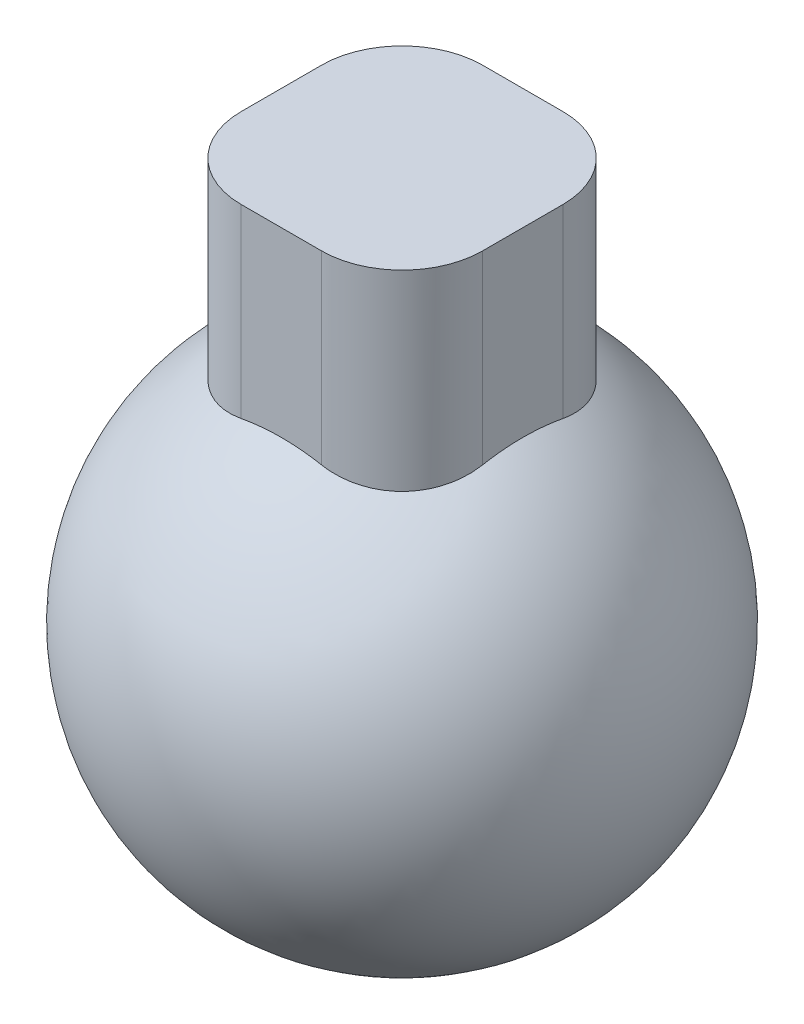
ISO-10303-21;
HEADER;
FILE_DESCRIPTION(('STEP AP214'),'2;1');
FILE_NAME('part.step','',(''),(''),'','','');
FILE_SCHEMA(('AUTOMOTIVE_DESIGN { 1 0 10303 214 1 1 1 1 }'));
ENDSEC;
DATA;
#1=APPLICATION_CONTEXT('core data for automotive mechanical design processes');
#2=APPLICATION_PROTOCOL_DEFINITION('international standard','automotive_design',2000,#1);
#3=PRODUCT_CONTEXT('',#1,'mechanical');
#4=PRODUCT('Part','Part','',(#3));
#5=PRODUCT_RELATED_PRODUCT_CATEGORY('part','',(#4));
#6=PRODUCT_DEFINITION_FORMATION('','',#4);
#7=PRODUCT_DEFINITION_CONTEXT('part definition',#1,'design');
#8=PRODUCT_DEFINITION('design','',#6,#7);
#9=PRODUCT_DEFINITION_SHAPE('','',#8);
#10=(LENGTH_UNIT() NAMED_UNIT(*) SI_UNIT(.MILLI.,.METRE.));
#11=(NAMED_UNIT(*) PLANE_ANGLE_UNIT() SI_UNIT($,.RADIAN.));
#12=(NAMED_UNIT(*) SI_UNIT($,.STERADIAN.) SOLID_ANGLE_UNIT());
#13=UNCERTAINTY_MEASURE_WITH_UNIT(LENGTH_MEASURE(1.E-05),#10,'distance_accuracy_value','');
#14=(GEOMETRIC_REPRESENTATION_CONTEXT(3) GLOBAL_UNCERTAINTY_ASSIGNED_CONTEXT((#13)) GLOBAL_UNIT_ASSIGNED_CONTEXT((#10,
#11,#12)) REPRESENTATION_CONTEXT('',''));
#15=CARTESIAN_POINT('',(0.,0.,0.));
#16=DIRECTION('',(0.,0.,1.));
#17=DIRECTION('',(1.,0.,0.));
#18=AXIS2_PLACEMENT_3D('',#15,#16,#17);
#19=CARTESIAN_POINT('',(-7.62,25.4,7.62));
#20=DIRECTION('',(1.,0.,0.));
#21=DIRECTION('',(0.,0.,-1.));
#22=AXIS2_PLACEMENT_3D('',#19,#20,#21);
#23=PLANE('',#22);
#24=DIRECTION('',(0.,0.,1.));
#25=VECTOR('',#24,1.);
#26=CARTESIAN_POINT('',(-7.62,25.4,7.62));
#27=LINE('',#26,#25);
#28=CARTESIAN_POINT('',(-7.62,25.4,-2.53999999999999));
#29=VERTEX_POINT('',#28);
#30=CARTESIAN_POINT('',(-7.62,25.4,2.54));
#31=VERTEX_POINT('',#30);
#32=EDGE_CURVE('E217',#29,#31,#27,.T.);
#33=ORIENTED_EDGE('',*,*,#32,.F.);
#34=DIRECTION('',(0.,-1.,0.));
#35=VECTOR('',#34,1.);
#36=CARTESIAN_POINT('',(-7.62,25.4,-2.54));
#37=LINE('',#36,#35);
#38=CARTESIAN_POINT('',(-7.62,13.6930502445584,-2.54));
#39=VERTEX_POINT('',#38);
#40=EDGE_CURVE('E111',#29,#39,#37,.T.);
#41=ORIENTED_EDGE('',*,*,#40,.T.);
#42=CARTESIAN_POINT('',(-7.62,0.,0.));
#43=DIRECTION('',(1.,0.,0.));
#44=DIRECTION('',(0.,0.,-1.));
#45=AXIS2_PLACEMENT_3D('',#42,#43,#44);
#46=CIRCLE('',#45,13.9266372466579);
#47=CARTESIAN_POINT('',(-7.62,13.6930502445584,2.54));
#48=VERTEX_POINT('',#47);
#49=EDGE_CURVE('E102',#48,#39,#46,.F.);
#50=ORIENTED_EDGE('',*,*,#49,.F.);
#51=DIRECTION('',(0.,-1.,0.));
#52=VECTOR('',#51,1.);
#53=CARTESIAN_POINT('',(-7.62,25.4,2.54));
#54=LINE('',#53,#52);
#55=EDGE_CURVE('E108',#48,#31,#54,.F.);
#56=ORIENTED_EDGE('',*,*,#55,.T.);
#57=EDGE_LOOP('',(#33,#41,#50,#56));
#58=FACE_BOUND('',#57,.T.);
#59=ADVANCED_FACE('F33',(#58),#23,.F.);
#60=CARTESIAN_POINT('',(7.62,25.4,7.62));
#61=DIRECTION('',(0.,0.,-1.));
#62=DIRECTION('',(-1.,0.,0.));
#63=AXIS2_PLACEMENT_3D('',#60,#61,#62);
#64=PLANE('',#63);
#65=DIRECTION('',(1.,0.,0.));
#66=VECTOR('',#65,1.);
#67=CARTESIAN_POINT('',(7.62,25.4,7.62));
#68=LINE('',#67,#66);
#69=CARTESIAN_POINT('',(-2.53999999999999,25.4,7.62));
#70=VERTEX_POINT('',#69);
#71=CARTESIAN_POINT('',(2.54,25.4,7.62));
#72=VERTEX_POINT('',#71);
#73=EDGE_CURVE('E214',#70,#72,#68,.T.);
#74=ORIENTED_EDGE('',*,*,#73,.F.);
#75=DIRECTION('',(0.,-1.,0.));
#76=VECTOR('',#75,1.);
#77=CARTESIAN_POINT('',(-2.54,25.4,7.62));
#78=LINE('',#77,#76);
#79=CARTESIAN_POINT('',(-2.54,13.6930502445584,7.62));
#80=VERTEX_POINT('',#79);
#81=EDGE_CURVE('E139',#70,#80,#78,.T.);
#82=ORIENTED_EDGE('',*,*,#81,.T.);
#83=CARTESIAN_POINT('',(0.,0.,7.62));
#84=DIRECTION('',(0.,0.,-1.));
#85=DIRECTION('',(-1.,0.,0.));
#86=AXIS2_PLACEMENT_3D('',#83,#84,#85);
#87=CIRCLE('',#86,13.9266372466579);
#88=CARTESIAN_POINT('',(2.54,13.6930502445584,7.62));
#89=VERTEX_POINT('',#88);
#90=EDGE_CURVE('E103',#89,#80,#87,.F.);
#91=ORIENTED_EDGE('',*,*,#90,.F.);
#92=DIRECTION('',(0.,-1.,0.));
#93=VECTOR('',#92,1.);
#94=CARTESIAN_POINT('',(2.54,25.4,7.62));
#95=LINE('',#94,#93);
#96=EDGE_CURVE('E137',#89,#72,#95,.F.);
#97=ORIENTED_EDGE('',*,*,#96,.T.);
#98=EDGE_LOOP('',(#74,#82,#91,#97));
#99=FACE_BOUND('',#98,.T.);
#100=ADVANCED_FACE('F176',(#99),#64,.F.);
#101=CARTESIAN_POINT('',(7.62,25.4,7.62));
#102=DIRECTION('',(-1.,0.,0.));
#103=DIRECTION('',(0.,0.,1.));
#104=AXIS2_PLACEMENT_3D('',#101,#102,#103);
#105=PLANE('',#104);
#106=CARTESIAN_POINT('',(7.62,0.,0.));
#107=DIRECTION('',(-1.,0.,0.));
#108=DIRECTION('',(0.,0.,1.));
#109=AXIS2_PLACEMENT_3D('',#106,#107,#108);
#110=CIRCLE('',#109,13.9266372466579);
#111=CARTESIAN_POINT('',(7.62,13.6930502445584,-2.54));
#112=VERTEX_POINT('',#111);
#113=CARTESIAN_POINT('',(7.62,13.6930502445584,2.54));
#114=VERTEX_POINT('',#113);
#115=EDGE_CURVE('E209',#112,#114,#110,.F.);
#116=ORIENTED_EDGE('',*,*,#115,.F.);
#117=DIRECTION('',(0.,-1.,0.));
#118=VECTOR('',#117,1.);
#119=CARTESIAN_POINT('',(7.62,25.4,-2.54));
#120=LINE('',#119,#118);
#121=CARTESIAN_POINT('',(7.62,25.4,-2.54));
#122=VERTEX_POINT('',#121);
#123=EDGE_CURVE('E135',#112,#122,#120,.F.);
#124=ORIENTED_EDGE('',*,*,#123,.T.);
#125=DIRECTION('',(0.,0.,-1.));
#126=VECTOR('',#125,1.);
#127=CARTESIAN_POINT('',(7.62,25.4,7.62));
#128=LINE('',#127,#126);
#129=CARTESIAN_POINT('',(7.62,25.4,2.54));
#130=VERTEX_POINT('',#129);
#131=EDGE_CURVE('E204',#130,#122,#128,.T.);
#132=ORIENTED_EDGE('',*,*,#131,.F.);
#133=DIRECTION('',(0.,-1.,0.));
#134=VECTOR('',#133,1.);
#135=CARTESIAN_POINT('',(7.62,25.4,2.54));
#136=LINE('',#135,#134);
#137=EDGE_CURVE('E132',#130,#114,#136,.T.);
#138=ORIENTED_EDGE('',*,*,#137,.T.);
#139=EDGE_LOOP('',(#116,#124,#132,#138));
#140=FACE_BOUND('',#139,.T.);
#141=ADVANCED_FACE('F180',(#140),#105,.F.);
#142=CARTESIAN_POINT('',(7.62,25.4,-7.62));
#143=DIRECTION('',(0.,0.,1.));
#144=DIRECTION('',(1.,0.,0.));
#145=AXIS2_PLACEMENT_3D('',#142,#143,#144);
#146=PLANE('',#145);
#147=CARTESIAN_POINT('',(0.,0.,-7.62));
#148=DIRECTION('',(0.,0.,1.));
#149=DIRECTION('',(1.,0.,0.));
#150=AXIS2_PLACEMENT_3D('',#147,#148,#149);
#151=CIRCLE('',#150,13.9266372466579);
#152=CARTESIAN_POINT('',(-2.54,13.6930502445584,-7.62));
#153=VERTEX_POINT('',#152);
#154=CARTESIAN_POINT('',(2.54,13.6930502445584,-7.62));
#155=VERTEX_POINT('',#154);
#156=EDGE_CURVE('E203',#153,#155,#151,.F.);
#157=ORIENTED_EDGE('',*,*,#156,.F.);
#158=DIRECTION('',(0.,-1.,0.));
#159=VECTOR('',#158,1.);
#160=CARTESIAN_POINT('',(-2.54,25.4,-7.62));
#161=LINE('',#160,#159);
#162=CARTESIAN_POINT('',(-2.53999999999999,25.4,-7.62));
#163=VERTEX_POINT('',#162);
#164=EDGE_CURVE('E123',#153,#163,#161,.F.);
#165=ORIENTED_EDGE('',*,*,#164,.T.);
#166=DIRECTION('',(-1.,0.,0.));
#167=VECTOR('',#166,1.);
#168=CARTESIAN_POINT('',(7.62,25.4,-7.62));
#169=LINE('',#168,#167);
#170=CARTESIAN_POINT('',(2.54,25.4,-7.62));
#171=VERTEX_POINT('',#170);
#172=EDGE_CURVE('E199',#171,#163,#169,.T.);
#173=ORIENTED_EDGE('',*,*,#172,.F.);
#174=DIRECTION('',(0.,-1.,0.));
#175=VECTOR('',#174,1.);
#176=CARTESIAN_POINT('',(2.54,25.4,-7.62));
#177=LINE('',#176,#175);
#178=EDGE_CURVE('E117',#171,#155,#177,.T.);
#179=ORIENTED_EDGE('',*,*,#178,.T.);
#180=EDGE_LOOP('',(#157,#165,#173,#179));
#181=FACE_BOUND('',#180,.T.);
#182=ADVANCED_FACE('F185',(#181),#146,.F.);
#183=CARTESIAN_POINT('',(0.,25.4,0.));
#184=DIRECTION('',(0.,1.,0.));
#185=DIRECTION('',(0.,0.,1.));
#186=AXIS2_PLACEMENT_3D('',#183,#184,#185);
#187=PLANE('',#186);
#188=ORIENTED_EDGE('',*,*,#172,.T.);
#189=CARTESIAN_POINT('',(-2.54,25.4,-2.54));
#190=DIRECTION('',(0.,1.,0.));
#191=DIRECTION('',(0.,0.,1.));
#192=AXIS2_PLACEMENT_3D('',#189,#190,#191);
#193=CIRCLE('',#192,5.08);
#194=EDGE_CURVE('E130',#163,#29,#193,.T.);
#195=ORIENTED_EDGE('',*,*,#194,.T.);
#196=ORIENTED_EDGE('',*,*,#32,.T.);
#197=CARTESIAN_POINT('',(-2.54,25.4,2.54));
#198=DIRECTION('',(0.,1.,0.));
#199=DIRECTION('',(0.,0.,1.));
#200=AXIS2_PLACEMENT_3D('',#197,#198,#199);
#201=CIRCLE('',#200,5.08);
#202=EDGE_CURVE('E115',#31,#70,#201,.T.);
#203=ORIENTED_EDGE('',*,*,#202,.T.);
#204=ORIENTED_EDGE('',*,*,#73,.T.);
#205=CARTESIAN_POINT('',(2.54,25.4,2.54));
#206=DIRECTION('',(0.,1.,0.));
#207=DIRECTION('',(0.,0.,1.));
#208=AXIS2_PLACEMENT_3D('',#205,#206,#207);
#209=CIRCLE('',#208,5.08);
#210=EDGE_CURVE('E125',#72,#130,#209,.T.);
#211=ORIENTED_EDGE('',*,*,#210,.T.);
#212=ORIENTED_EDGE('',*,*,#131,.T.);
#213=CARTESIAN_POINT('',(2.54,25.4,-2.54));
#214=DIRECTION('',(0.,1.,0.));
#215=DIRECTION('',(0.,0.,1.));
#216=AXIS2_PLACEMENT_3D('',#213,#214,#215);
#217=CIRCLE('',#216,5.08);
#218=EDGE_CURVE('E128',#122,#171,#217,.T.);
#219=ORIENTED_EDGE('',*,*,#218,.T.);
#220=EDGE_LOOP('',(#188,#195,#196,#203,#204,#211,#212,#219));
#221=FACE_BOUND('',#220,.T.);
#222=ADVANCED_FACE('F156',(#221),#187,.T.);
#223=CARTESIAN_POINT('',(0.,0.,0.));
#224=DIRECTION('',(0.,-1.,0.));
#225=DIRECTION('',(-1.,0.,0.));
#226=AXIS2_PLACEMENT_3D('',#223,#224,#225);
#227=SPHERICAL_SURFACE('',#226,15.875);
#228=ORIENTED_EDGE('',*,*,#115,.T.);
#229=CARTESIAN_POINT('',(7.62,13.6930502445584,2.54));
#230=CARTESIAN_POINT('',(7.62001430279167,13.6671449904805,2.67964142103282));
#231=CARTESIAN_POINT('',(7.61424261825292,13.6422044630363,2.81946878556263));
#232=CARTESIAN_POINT('',(7.59113779909867,13.5944617964455,3.09854756001946));
#233=CARTESIAN_POINT('',(7.57380334955504,13.5716599008424,3.23779890262831));
#234=CARTESIAN_POINT('',(7.52757691899768,13.5284032387953,3.51478518198028));
#235=CARTESIAN_POINT('',(7.49868163468431,13.5079491453448,3.65251967374291));
#236=CARTESIAN_POINT('',(7.42945498729696,13.4695925600994,3.92544050912427));
#237=CARTESIAN_POINT('',(7.38912426597958,13.4516899252014,4.06062699528313));
#238=CARTESIAN_POINT('',(7.29717929715096,13.4185950487846,4.32762509293664));
#239=CARTESIAN_POINT('',(7.24555228599233,13.403405908788,4.4594326969029));
#240=CARTESIAN_POINT('',(7.13132419383538,13.3759154266158,4.71857751796192));
#241=CARTESIAN_POINT('',(7.06871904793946,13.3636151580691,4.84591305813849));
#242=CARTESIAN_POINT('',(6.93301454126857,13.342051381539,5.09497881279569));
#243=CARTESIAN_POINT('',(6.8599250607882,13.3327850411113,5.21671416375019));
#244=CARTESIAN_POINT('',(6.70367941684273,13.317371937908,5.4538184646509));
#245=CARTESIAN_POINT('',(6.62051961995426,13.3112263052787,5.56918509474072));
#246=CARTESIAN_POINT('',(6.44652842959471,13.3022200282809,5.79035881038193));
#247=CARTESIAN_POINT('',(6.35588583713319,13.2992955617287,5.89631188110608));
#248=CARTESIAN_POINT('',(6.16614043012923,13.2965429983918,6.10046808066858));
#249=CARTESIAN_POINT('',(6.06703452323284,13.2967160382436,6.1986683513237));
#250=CARTESIAN_POINT('',(5.86114154681419,13.300158970424,6.38653547768665));
#251=CARTESIAN_POINT('',(5.75435662109089,13.3034280015033,6.4762046989455));
#252=CARTESIAN_POINT('',(5.53382637894128,13.3130280875574,6.6464356536207));
#253=CARTESIAN_POINT('',(5.42007854622875,13.3193602552766,6.72699406422528));
#254=CARTESIAN_POINT('',(5.1876968122679,13.334939032334,6.87763505527054));
#255=CARTESIAN_POINT('',(5.06912499334427,13.3441550825009,6.94781660979765));
#256=CARTESIAN_POINT('',(4.82683027176991,13.3654297074096,7.07825375036877));
#257=CARTESIAN_POINT('',(4.70310539834713,13.3774893780601,7.13850549429456));
#258=CARTESIAN_POINT('',(4.45147172819475,13.4043243192202,7.24866492684367));
#259=CARTESIAN_POINT('',(4.3235646222442,13.4190985032059,7.29857673723145));
#260=CARTESIAN_POINT('',(4.06441849834928,13.4512198098732,7.38781944894503));
#261=CARTESIAN_POINT('',(3.93317860422567,13.4685676150787,7.42714753565958));
#262=CARTESIAN_POINT('',(3.59406525013785,13.516073675366,7.51400834111299));
#263=CARTESIAN_POINT('',(3.38438289559044,13.5479702994526,7.55382832608513));
#264=CARTESIAN_POINT('',(3.06832885336704,13.5996425857725,7.59356936065462));
#265=CARTESIAN_POINT('',(2.96277888766983,13.6174940771106,7.60348491236526));
#266=CARTESIAN_POINT('',(2.75146340599305,13.6543948614184,7.61669934188386));
#267=CARTESIAN_POINT('',(2.64569787045985,13.6734442681951,7.61999759003821));
#268=CARTESIAN_POINT('',(2.54,13.6930502445584,7.62));
#269=B_SPLINE_CURVE_WITH_KNOTS('',3,(#229,#230,#231,#232,#233,#234,#235,#236,#237,#238,#239,
#240,#241,#242,#243,#244,#245,#246,#247,#248,#249,#250,#251,#252,#253,#254,#255,#256,#257,#258,
#259,#260,#261,#262,#263,#264,#265,#266,#267,#268),.UNSPECIFIED.,.F.,.F.,(4,2,2,2,2,2,2,2,2,2,2,
2,2,2,2,2,2,2,2,4),(0.,0.425961558885983,0.851971566767379,1.27810338634154,1.70421129613413,
2.13080317345177,2.55755334068498,2.9839039546893,3.4104088591667,3.82830214474357,
4.24634878027915,4.66427915689353,5.0823614690481,5.49615557117371,5.9101094076745,
6.32389791261455,6.73779635102229,7.38317789736044,7.70552643132413,8.02790563613364),.UNSPECIFIED.);
#270=EDGE_CURVE('E11',#114,#89,#269,.T.);
#271=ORIENTED_EDGE('',*,*,#270,.T.);
#272=ORIENTED_EDGE('',*,*,#90,.T.);
#273=CARTESIAN_POINT('',(-2.54,13.6930502445584,7.62));
#274=CARTESIAN_POINT('',(-2.67964142103282,13.6671449904805,7.62001430279167));
#275=CARTESIAN_POINT('',(-2.81946878556262,13.6422044630363,7.61424261825292));
#276=CARTESIAN_POINT('',(-3.09854756001946,13.5944617964455,7.59113779909867));
#277=CARTESIAN_POINT('',(-3.23779890262831,13.5716599008424,7.57380334955504));
#278=CARTESIAN_POINT('',(-3.51478518198028,13.5284032387953,7.52757691899768));
#279=CARTESIAN_POINT('',(-3.65251967374291,13.5079491453448,7.49868163468431));
#280=CARTESIAN_POINT('',(-3.92544050912427,13.4695925600994,7.42945498729696));
#281=CARTESIAN_POINT('',(-4.06062699528313,13.4516899252014,7.38912426597958));
#282=CARTESIAN_POINT('',(-4.32762509293664,13.4185950487846,7.29717929715096));
#283=CARTESIAN_POINT('',(-4.4594326969029,13.403405908788,7.24555228599233));
#284=CARTESIAN_POINT('',(-4.71857751796192,13.3759154266158,7.13132419383538));
#285=CARTESIAN_POINT('',(-4.84591305813849,13.3636151580691,7.06871904793946));
#286=CARTESIAN_POINT('',(-5.09497881279569,13.342051381539,6.93301454126857));
#287=CARTESIAN_POINT('',(-5.21671416375019,13.3327850411113,6.8599250607882));
#288=CARTESIAN_POINT('',(-5.4538184646509,13.317371937908,6.70367941684272));
#289=CARTESIAN_POINT('',(-5.56918509474072,13.3112263052787,6.62051961995426));
#290=CARTESIAN_POINT('',(-5.79035881038194,13.3022200282809,6.44652842959471));
#291=CARTESIAN_POINT('',(-5.89631188110608,13.2992955617287,6.35588583713319));
#292=CARTESIAN_POINT('',(-6.10046808066858,13.2965429983918,6.16614043012923));
#293=CARTESIAN_POINT('',(-6.1986683513237,13.2967160382436,6.06703452323283));
#294=CARTESIAN_POINT('',(-6.38653547768665,13.300158970424,5.86114154681419));
#295=CARTESIAN_POINT('',(-6.4762046989455,13.3034280015033,5.75435662109089));
#296=CARTESIAN_POINT('',(-6.6464356536207,13.3130280875574,5.53382637894128));
#297=CARTESIAN_POINT('',(-6.72699406422529,13.3193602552766,5.42007854622874));
#298=CARTESIAN_POINT('',(-6.87763505527054,13.334939032334,5.18769681226789));
#299=CARTESIAN_POINT('',(-6.94781660979765,13.3441550825009,5.06912499334427));
#300=CARTESIAN_POINT('',(-7.07825375036877,13.3654297074096,4.82683027176991));
#301=CARTESIAN_POINT('',(-7.13850549429456,13.3774893780601,4.70310539834712));
#302=CARTESIAN_POINT('',(-7.24866492684367,13.4043243192202,4.45147172819475));
#303=CARTESIAN_POINT('',(-7.29857673723145,13.4190985032059,4.32356462224419));
#304=CARTESIAN_POINT('',(-7.38781944894503,13.4512198098732,4.06441849834928));
#305=CARTESIAN_POINT('',(-7.42714753565959,13.4685676150787,3.93317860422566));
#306=CARTESIAN_POINT('',(-7.51400834111299,13.516073675366,3.59406525013785));
#307=CARTESIAN_POINT('',(-7.55382832608513,13.5479702994526,3.38438289559043));
#308=CARTESIAN_POINT('',(-7.59356936065462,13.5996425857725,3.06832885336704));
#309=CARTESIAN_POINT('',(-7.60348491236526,13.6174940771106,2.96277888766983));
#310=CARTESIAN_POINT('',(-7.61669934188386,13.6543948614184,2.75146340599305));
#311=CARTESIAN_POINT('',(-7.6199975900382,13.6734442681951,2.64569787045985));
#312=CARTESIAN_POINT('',(-7.62,13.6930502445584,2.54));
#313=B_SPLINE_CURVE_WITH_KNOTS('',3,(#273,#274,#275,#276,#277,#278,#279,#280,#281,#282,#283,
#284,#285,#286,#287,#288,#289,#290,#291,#292,#293,#294,#295,#296,#297,#298,#299,#300,#301,#302,
#303,#304,#305,#306,#307,#308,#309,#310,#311,#312),.UNSPECIFIED.,.F.,.F.,(4,2,2,2,2,2,2,2,2,2,2,
2,2,2,2,2,2,2,2,4),(0.,0.425961558885984,0.85197156676738,1.27810338634154,1.70421129613413,
2.13080317345177,2.55755334068498,2.98390395468931,3.4104088591667,3.82830214474358,
4.24634878027915,4.66427915689353,5.0823614690481,5.49615557117372,5.9101094076745,
6.32389791261456,6.73779635102229,7.38317789736044,7.70552643132413,8.02790563613364),.UNSPECIFIED.);
#314=EDGE_CURVE('E46',#80,#48,#313,.T.);
#315=ORIENTED_EDGE('',*,*,#314,.T.);
#316=ORIENTED_EDGE('',*,*,#49,.T.);
#317=CARTESIAN_POINT('',(-7.62,13.6930502445584,-2.54));
#318=CARTESIAN_POINT('',(-7.62001430279166,13.6671449904805,-2.67964142103282));
#319=CARTESIAN_POINT('',(-7.61424261825292,13.6422044630363,-2.81946878556263));
#320=CARTESIAN_POINT('',(-7.59113779909867,13.5944617964455,-3.09854756001946));
#321=CARTESIAN_POINT('',(-7.57380334955503,13.5716599008424,-3.23779890262831));
#322=CARTESIAN_POINT('',(-7.52757691899767,13.5284032387953,-3.51478518198028));
#323=CARTESIAN_POINT('',(-7.4986816346843,13.5079491453448,-3.65251967374291));
#324=CARTESIAN_POINT('',(-7.42945498729695,13.4695925600994,-3.92544050912427));
#325=CARTESIAN_POINT('',(-7.38912426597958,13.4516899252014,-4.06062699528313));
#326=CARTESIAN_POINT('',(-7.29717929715096,13.4185950487846,-4.32762509293664));
#327=CARTESIAN_POINT('',(-7.24555228599233,13.403405908788,-4.4594326969029));
#328=CARTESIAN_POINT('',(-7.13132419383538,13.3759154266158,-4.71857751796192));
#329=CARTESIAN_POINT('',(-7.06871904793945,13.3636151580691,-4.84591305813849));
#330=CARTESIAN_POINT('',(-6.93301454126857,13.342051381539,-5.09497881279569));
#331=CARTESIAN_POINT('',(-6.8599250607882,13.3327850411113,-5.21671416375019));
#332=CARTESIAN_POINT('',(-6.70367941684272,13.317371937908,-5.4538184646509));
#333=CARTESIAN_POINT('',(-6.62051961995426,13.3112263052787,-5.56918509474072));
#334=CARTESIAN_POINT('',(-6.44652842959471,13.3022200282809,-5.79035881038193));
#335=CARTESIAN_POINT('',(-6.35588583713319,13.2992955617287,-5.89631188110608));
#336=CARTESIAN_POINT('',(-6.16614043012923,13.2965429983918,-6.10046808066858));
#337=CARTESIAN_POINT('',(-6.06703452323283,13.2967160382436,-6.1986683513237));
#338=CARTESIAN_POINT('',(-5.86114154681419,13.300158970424,-6.38653547768665));
#339=CARTESIAN_POINT('',(-5.75435662109089,13.3034280015033,-6.4762046989455));
#340=CARTESIAN_POINT('',(-5.53382637894128,13.3130280875574,-6.6464356536207));
#341=CARTESIAN_POINT('',(-5.42007854622874,13.3193602552766,-6.72699406422528));
#342=CARTESIAN_POINT('',(-5.18769681226789,13.334939032334,-6.87763505527054));
#343=CARTESIAN_POINT('',(-5.06912499334427,13.3441550825009,-6.94781660979765));
#344=CARTESIAN_POINT('',(-4.82683027176991,13.3654297074096,-7.07825375036877));
#345=CARTESIAN_POINT('',(-4.70310539834713,13.3774893780601,-7.13850549429456));
#346=CARTESIAN_POINT('',(-4.45147172819475,13.4043243192202,-7.24866492684367));
#347=CARTESIAN_POINT('',(-4.32356462224419,13.4190985032059,-7.29857673723145));
#348=CARTESIAN_POINT('',(-4.06441849834928,13.4512198098732,-7.38781944894503));
#349=CARTESIAN_POINT('',(-3.93317860422566,13.4685676150787,-7.42714753565958));
#350=CARTESIAN_POINT('',(-3.59406525013785,13.516073675366,-7.51400834111299));
#351=CARTESIAN_POINT('',(-3.38438289559043,13.5479702994526,-7.55382832608513));
#352=CARTESIAN_POINT('',(-3.06832885336704,13.5996425857725,-7.59356936065462));
#353=CARTESIAN_POINT('',(-2.96277888766983,13.6174940771106,-7.60348491236526));
#354=CARTESIAN_POINT('',(-2.75146340599305,13.6543948614184,-7.61669934188386));
#355=CARTESIAN_POINT('',(-2.64569787045984,13.6734442681951,-7.6199975900382));
#356=CARTESIAN_POINT('',(-2.54,13.6930502445584,-7.62));
#357=B_SPLINE_CURVE_WITH_KNOTS('',3,(#317,#318,#319,#320,#321,#322,#323,#324,#325,#326,#327,
#328,#329,#330,#331,#332,#333,#334,#335,#336,#337,#338,#339,#340,#341,#342,#343,#344,#345,#346,
#347,#348,#349,#350,#351,#352,#353,#354,#355,#356),.UNSPECIFIED.,.F.,.F.,(4,2,2,2,2,2,2,2,2,2,2,
2,2,2,2,2,2,2,2,4),(0.,0.425961558885983,0.85197156676738,1.27810338634154,1.70421129613413,
2.13080317345177,2.55755334068498,2.9839039546893,3.4104088591667,3.82830214474357,
4.24634878027915,4.66427915689353,5.0823614690481,5.49615557117371,5.9101094076745,
6.32389791261455,6.73779635102229,7.38317789736044,7.70552643132413,8.02790563613364),.UNSPECIFIED.);
#358=EDGE_CURVE('E141',#39,#153,#357,.T.);
#359=ORIENTED_EDGE('',*,*,#358,.T.);
#360=ORIENTED_EDGE('',*,*,#156,.T.);
#361=CARTESIAN_POINT('',(2.54,13.6930502445584,-7.62));
#362=CARTESIAN_POINT('',(2.67964142103282,13.6671449904804,-7.62001430279167));
#363=CARTESIAN_POINT('',(2.81946878556263,13.6422044630363,-7.61424261825292));
#364=CARTESIAN_POINT('',(3.09854756001946,13.5944617964455,-7.59113779909867));
#365=CARTESIAN_POINT('',(3.23779890262831,13.5716599008424,-7.57380334955504));
#366=CARTESIAN_POINT('',(3.51478518198028,13.5284032387953,-7.52757691899768));
#367=CARTESIAN_POINT('',(3.65251967374291,13.5079491453448,-7.49868163468431));
#368=CARTESIAN_POINT('',(3.92544050912427,13.4695925600994,-7.42945498729696));
#369=CARTESIAN_POINT('',(4.06062699528313,13.4516899252014,-7.38912426597958));
#370=CARTESIAN_POINT('',(4.32762509293664,13.4185950487846,-7.29717929715096));
#371=CARTESIAN_POINT('',(4.4594326969029,13.403405908788,-7.24555228599233));
#372=CARTESIAN_POINT('',(4.71857751796192,13.3759154266158,-7.13132419383538));
#373=CARTESIAN_POINT('',(4.84591305813849,13.3636151580691,-7.06871904793946));
#374=CARTESIAN_POINT('',(5.09497881279569,13.342051381539,-6.93301454126857));
#375=CARTESIAN_POINT('',(5.21671416375019,13.3327850411113,-6.8599250607882));
#376=CARTESIAN_POINT('',(5.4538184646509,13.317371937908,-6.70367941684273));
#377=CARTESIAN_POINT('',(5.56918509474072,13.3112263052787,-6.62051961995426));
#378=CARTESIAN_POINT('',(5.79035881038194,13.3022200282809,-6.44652842959471));
#379=CARTESIAN_POINT('',(5.89631188110608,13.2992955617287,-6.35588583713319));
#380=CARTESIAN_POINT('',(6.10046808066859,13.2965429983918,-6.16614043012923));
#381=CARTESIAN_POINT('',(6.1986683513237,13.2967160382436,-6.06703452323284));
#382=CARTESIAN_POINT('',(6.38653547768665,13.300158970424,-5.86114154681419));
#383=CARTESIAN_POINT('',(6.4762046989455,13.3034280015033,-5.75435662109089));
#384=CARTESIAN_POINT('',(6.6464356536207,13.3130280875574,-5.53382637894128));
#385=CARTESIAN_POINT('',(6.72699406422529,13.3193602552766,-5.42007854622875));
#386=CARTESIAN_POINT('',(6.87763505527054,13.334939032334,-5.1876968122679));
#387=CARTESIAN_POINT('',(6.94781660979765,13.3441550825009,-5.06912499334427));
#388=CARTESIAN_POINT('',(7.07825375036877,13.3654297074096,-4.82683027176991));
#389=CARTESIAN_POINT('',(7.13850549429456,13.3774893780601,-4.70310539834713));
#390=CARTESIAN_POINT('',(7.24866492684367,13.4043243192202,-4.45147172819475));
#391=CARTESIAN_POINT('',(7.29857673723145,13.4190985032059,-4.3235646222442));
#392=CARTESIAN_POINT('',(7.38781944894503,13.4512198098732,-4.06441849834928));
#393=CARTESIAN_POINT('',(7.42714753565959,13.4685676150787,-3.93317860422567));
#394=CARTESIAN_POINT('',(7.51400834111299,13.516073675366,-3.59406525013785));
#395=CARTESIAN_POINT('',(7.55382832608513,13.5479702994526,-3.38438289559044));
#396=CARTESIAN_POINT('',(7.59356936065463,13.5996425857725,-3.06832885336704));
#397=CARTESIAN_POINT('',(7.60348491236526,13.6174940771106,-2.96277888766983));
#398=CARTESIAN_POINT('',(7.61669934188386,13.6543948614184,-2.75146340599305));
#399=CARTESIAN_POINT('',(7.61999759003821,13.6734442681951,-2.64569787045985));
#400=CARTESIAN_POINT('',(7.62,13.6930502445584,-2.54));
#401=B_SPLINE_CURVE_WITH_KNOTS('',3,(#361,#362,#363,#364,#365,#366,#367,#368,#369,#370,#371,
#372,#373,#374,#375,#376,#377,#378,#379,#380,#381,#382,#383,#384,#385,#386,#387,#388,#389,#390,
#391,#392,#393,#394,#395,#396,#397,#398,#399,#400),.UNSPECIFIED.,.F.,.F.,(4,2,2,2,2,2,2,2,2,2,2,
2,2,2,2,2,2,2,2,4),(0.,0.425961558885983,0.851971566767379,1.27810338634154,1.70421129613413,
2.13080317345177,2.55755334068498,2.9839039546893,3.4104088591667,3.82830214474357,
4.24634878027915,4.66427915689353,5.0823614690481,5.49615557117371,5.9101094076745,
6.32389791261455,6.73779635102229,7.38317789736044,7.70552643132413,8.02790563613364),.UNSPECIFIED.);
#402=EDGE_CURVE('E104',#155,#112,#401,.T.);
#403=ORIENTED_EDGE('',*,*,#402,.T.);
#404=EDGE_LOOP('',(#228,#271,#272,#315,#316,#359,#360,#403));
#405=FACE_BOUND('',#404,.T.);
#406=ADVANCED_FACE('F101',(#405),#227,.T.);
#407=CARTESIAN_POINT('',(-2.54,25.4,-2.54));
#408=DIRECTION('',(0.,-1.,0.));
#409=DIRECTION('',(0.,0.,-1.));
#410=AXIS2_PLACEMENT_3D('',#407,#408,#409);
#411=CYLINDRICAL_SURFACE('',#410,5.08);
#412=ORIENTED_EDGE('',*,*,#194,.F.);
#413=ORIENTED_EDGE('',*,*,#164,.F.);
#414=ORIENTED_EDGE('',*,*,#358,.F.);
#415=ORIENTED_EDGE('',*,*,#40,.F.);
#416=EDGE_LOOP('',(#412,#413,#414,#415));
#417=FACE_BOUND('',#416,.T.);
#418=ADVANCED_FACE('F151',(#417),#411,.T.);
#419=CARTESIAN_POINT('',(2.54,25.4,-2.54));
#420=DIRECTION('',(0.,-1.,0.));
#421=DIRECTION('',(0.,0.,-1.));
#422=AXIS2_PLACEMENT_3D('',#419,#420,#421);
#423=CYLINDRICAL_SURFACE('',#422,5.08);
#424=ORIENTED_EDGE('',*,*,#218,.F.);
#425=ORIENTED_EDGE('',*,*,#123,.F.);
#426=ORIENTED_EDGE('',*,*,#402,.F.);
#427=ORIENTED_EDGE('',*,*,#178,.F.);
#428=EDGE_LOOP('',(#424,#425,#426,#427));
#429=FACE_BOUND('',#428,.T.);
#430=ADVANCED_FACE('F166',(#429),#423,.T.);
#431=CARTESIAN_POINT('',(-2.54,25.4,2.54));
#432=DIRECTION('',(0.,-1.,0.));
#433=DIRECTION('',(0.,0.,-1.));
#434=AXIS2_PLACEMENT_3D('',#431,#432,#433);
#435=CYLINDRICAL_SURFACE('',#434,5.08);
#436=ORIENTED_EDGE('',*,*,#202,.F.);
#437=ORIENTED_EDGE('',*,*,#55,.F.);
#438=ORIENTED_EDGE('',*,*,#314,.F.);
#439=ORIENTED_EDGE('',*,*,#81,.F.);
#440=EDGE_LOOP('',(#436,#437,#438,#439));
#441=FACE_BOUND('',#440,.T.);
#442=ADVANCED_FACE('F114',(#441),#435,.T.);
#443=CARTESIAN_POINT('',(2.54,25.4,2.54));
#444=DIRECTION('',(0.,-1.,0.));
#445=DIRECTION('',(0.,0.,-1.));
#446=AXIS2_PLACEMENT_3D('',#443,#444,#445);
#447=CYLINDRICAL_SURFACE('',#446,5.08);
#448=ORIENTED_EDGE('',*,*,#210,.F.);
#449=ORIENTED_EDGE('',*,*,#96,.F.);
#450=ORIENTED_EDGE('',*,*,#270,.F.);
#451=ORIENTED_EDGE('',*,*,#137,.F.);
#452=EDGE_LOOP('',(#448,#449,#450,#451));
#453=FACE_BOUND('',#452,.T.);
#454=ADVANCED_FACE('F35',(#453),#447,.T.);
#455=CLOSED_SHELL('',(#59,#100,#141,#182,#222,#406,#418,#430,#442,#454));
#456=MANIFOLD_SOLID_BREP('B2',#455);
#457=ADVANCED_BREP_SHAPE_REPRESENTATION('',(#18,#456),#14);
#458=SHAPE_DEFINITION_REPRESENTATION(#9,#457);
ENDSEC;
END-ISO-10303-21;
